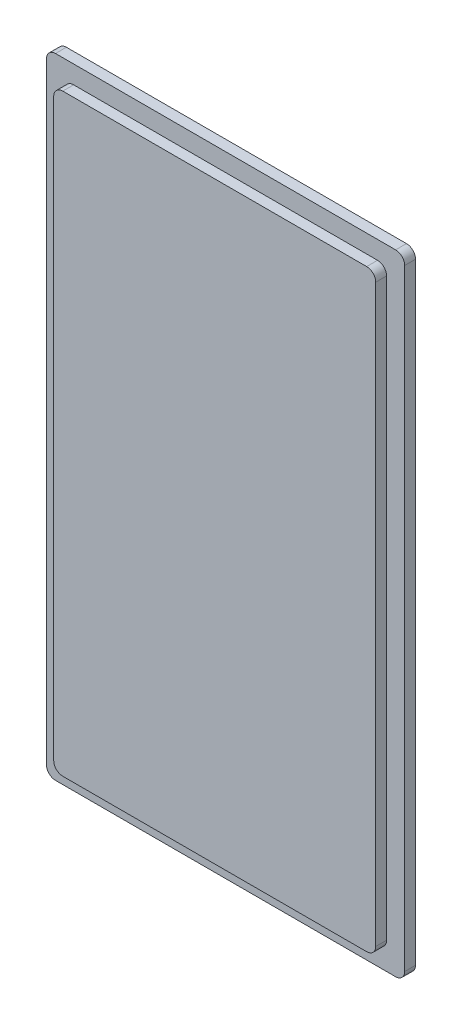
ISO-10303-21;
HEADER;
FILE_DESCRIPTION(('STEP AP214'),'2;1');
FILE_NAME('part.step','',(''),(''),'','','');
FILE_SCHEMA(('AUTOMOTIVE_DESIGN { 1 0 10303 214 1 1 1 1 }'));
ENDSEC;
DATA;
#1=APPLICATION_CONTEXT('core data for automotive mechanical design processes');
#2=APPLICATION_PROTOCOL_DEFINITION('international standard','automotive_design',2000,#1);
#3=PRODUCT_CONTEXT('',#1,'mechanical');
#4=PRODUCT('Part','Part','',(#3));
#5=PRODUCT_RELATED_PRODUCT_CATEGORY('part','',(#4));
#6=PRODUCT_DEFINITION_FORMATION('','',#4);
#7=PRODUCT_DEFINITION_CONTEXT('part definition',#1,'design');
#8=PRODUCT_DEFINITION('design','',#6,#7);
#9=PRODUCT_DEFINITION_SHAPE('','',#8);
#10=(LENGTH_UNIT() NAMED_UNIT(*) SI_UNIT(.MILLI.,.METRE.));
#11=(NAMED_UNIT(*) PLANE_ANGLE_UNIT() SI_UNIT($,.RADIAN.));
#12=(NAMED_UNIT(*) SI_UNIT($,.STERADIAN.) SOLID_ANGLE_UNIT());
#13=UNCERTAINTY_MEASURE_WITH_UNIT(LENGTH_MEASURE(1.E-05),#10,'distance_accuracy_value','');
#14=(GEOMETRIC_REPRESENTATION_CONTEXT(3) GLOBAL_UNCERTAINTY_ASSIGNED_CONTEXT((#13)) GLOBAL_UNIT_ASSIGNED_CONTEXT((#10,
#11,#12)) REPRESENTATION_CONTEXT('',''));
#15=CARTESIAN_POINT('',(0.,0.,0.));
#16=DIRECTION('',(0.,0.,1.));
#17=DIRECTION('',(1.,0.,0.));
#18=AXIS2_PLACEMENT_3D('',#15,#16,#17);
#19=CARTESIAN_POINT('',(-55.3144774068386,-300.986069156775,6.));
#20=DIRECTION('',(0.,0.,-1.));
#21=DIRECTION('',(-1.,0.,0.));
#22=AXIS2_PLACEMENT_3D('',#19,#20,#21);
#23=CYLINDRICAL_SURFACE('',#22,5.);
#24=CARTESIAN_POINT('',(-55.3144774068386,-300.986069156775,0.));
#25=DIRECTION('',(0.,0.,1.));
#26=DIRECTION('',(1.,0.,0.));
#27=AXIS2_PLACEMENT_3D('',#24,#25,#26);
#28=CIRCLE('',#27,5.);
#29=CARTESIAN_POINT('',(-60.3144774068386,-300.986069156775,0.));
#30=VERTEX_POINT('',#29);
#31=CARTESIAN_POINT('',(-55.3144774068386,-305.986069156775,0.));
#32=VERTEX_POINT('',#31);
#33=EDGE_CURVE('E149',#30,#32,#28,.T.);
#34=ORIENTED_EDGE('',*,*,#33,.T.);
#35=DIRECTION('',(0.,0.,-1.));
#36=VECTOR('',#35,1.);
#37=CARTESIAN_POINT('',(-55.3144774068386,-305.986069156775,6.));
#38=LINE('',#37,#36);
#39=CARTESIAN_POINT('',(-55.3144774068386,-305.986069156775,6.));
#40=VERTEX_POINT('',#39);
#41=EDGE_CURVE('E11',#40,#32,#38,.T.);
#42=ORIENTED_EDGE('',*,*,#41,.F.);
#43=CARTESIAN_POINT('',(-55.3144774068386,-300.986069156775,6.));
#44=DIRECTION('',(0.,0.,1.));
#45=DIRECTION('',(1.,0.,0.));
#46=AXIS2_PLACEMENT_3D('',#43,#44,#45);
#47=CIRCLE('',#46,5.);
#48=CARTESIAN_POINT('',(-60.3144774068386,-300.986069156775,6.));
#49=VERTEX_POINT('',#48);
#50=EDGE_CURVE('E158',#49,#40,#47,.T.);
#51=ORIENTED_EDGE('',*,*,#50,.F.);
#52=DIRECTION('',(0.,0.,-1.));
#53=VECTOR('',#52,1.);
#54=CARTESIAN_POINT('',(-60.3144774068386,-300.986069156775,6.));
#55=LINE('',#54,#53);
#56=EDGE_CURVE('E175',#49,#30,#55,.T.);
#57=ORIENTED_EDGE('',*,*,#56,.T.);
#58=EDGE_LOOP('',(#34,#42,#51,#57));
#59=FACE_BOUND('',#58,.T.);
#60=ADVANCED_FACE('F17',(#59),#23,.T.);
#61=CARTESIAN_POINT('',(-55.3144774068386,-305.986069156775,6.));
#62=DIRECTION('',(0.,1.,0.));
#63=DIRECTION('',(0.,0.,1.));
#64=AXIS2_PLACEMENT_3D('',#61,#62,#63);
#65=PLANE('',#64);
#66=DIRECTION('',(1.,0.,0.));
#67=VECTOR('',#66,1.);
#68=CARTESIAN_POINT('',(-55.3144774068386,-305.986069156775,0.));
#69=LINE('',#68,#67);
#70=CARTESIAN_POINT('',(132.685522593161,-305.986069156775,0.));
#71=VERTEX_POINT('',#70);
#72=EDGE_CURVE('E152',#32,#71,#69,.T.);
#73=ORIENTED_EDGE('',*,*,#72,.T.);
#74=DIRECTION('',(0.,0.,-1.));
#75=VECTOR('',#74,1.);
#76=CARTESIAN_POINT('',(132.685522593161,-305.986069156775,6.));
#77=LINE('',#76,#75);
#78=CARTESIAN_POINT('',(132.685522593161,-305.986069156775,6.));
#79=VERTEX_POINT('',#78);
#80=EDGE_CURVE('E24',#79,#71,#77,.T.);
#81=ORIENTED_EDGE('',*,*,#80,.F.);
#82=DIRECTION('',(1.,0.,0.));
#83=VECTOR('',#82,1.);
#84=CARTESIAN_POINT('',(-55.3144774068386,-305.986069156775,6.));
#85=LINE('',#84,#83);
#86=EDGE_CURVE('E161',#40,#79,#85,.T.);
#87=ORIENTED_EDGE('',*,*,#86,.F.);
#88=ORIENTED_EDGE('',*,*,#41,.T.);
#89=EDGE_LOOP('',(#73,#81,#87,#88));
#90=FACE_BOUND('',#89,.T.);
#91=ADVANCED_FACE('F233',(#90),#65,.F.);
#92=CARTESIAN_POINT('',(132.685522593161,-300.986069156775,6.));
#93=DIRECTION('',(0.,0.,-1.));
#94=DIRECTION('',(-1.,0.,0.));
#95=AXIS2_PLACEMENT_3D('',#92,#93,#94);
#96=CYLINDRICAL_SURFACE('',#95,5.);
#97=CARTESIAN_POINT('',(132.685522593161,-300.986069156775,0.));
#98=DIRECTION('',(0.,0.,1.));
#99=DIRECTION('',(1.,0.,0.));
#100=AXIS2_PLACEMENT_3D('',#97,#98,#99);
#101=CIRCLE('',#100,5.);
#102=CARTESIAN_POINT('',(137.685522593161,-300.986069156775,0.));
#103=VERTEX_POINT('',#102);
#104=EDGE_CURVE('E178',#71,#103,#101,.T.);
#105=ORIENTED_EDGE('',*,*,#104,.T.);
#106=DIRECTION('',(0.,0.,-1.));
#107=VECTOR('',#106,1.);
#108=CARTESIAN_POINT('',(137.685522593161,-300.986069156775,6.));
#109=LINE('',#108,#107);
#110=CARTESIAN_POINT('',(137.685522593161,-300.986069156775,6.));
#111=VERTEX_POINT('',#110);
#112=EDGE_CURVE('E203',#111,#103,#109,.T.);
#113=ORIENTED_EDGE('',*,*,#112,.F.);
#114=CARTESIAN_POINT('',(132.685522593161,-300.986069156775,6.));
#115=DIRECTION('',(0.,0.,1.));
#116=DIRECTION('',(1.,0.,0.));
#117=AXIS2_PLACEMENT_3D('',#114,#115,#116);
#118=CIRCLE('',#117,5.);
#119=EDGE_CURVE('E164',#79,#111,#118,.T.);
#120=ORIENTED_EDGE('',*,*,#119,.F.);
#121=ORIENTED_EDGE('',*,*,#80,.T.);
#122=EDGE_LOOP('',(#105,#113,#120,#121));
#123=FACE_BOUND('',#122,.T.);
#124=ADVANCED_FACE('F210',(#123),#96,.T.);
#125=CARTESIAN_POINT('',(137.685522593161,-300.986069156775,6.));
#126=DIRECTION('',(-1.,0.,0.));
#127=DIRECTION('',(0.,0.,1.));
#128=AXIS2_PLACEMENT_3D('',#125,#126,#127);
#129=PLANE('',#128);
#130=DIRECTION('',(0.,1.,0.));
#131=VECTOR('',#130,1.);
#132=CARTESIAN_POINT('',(137.685522593161,-300.986069156775,0.));
#133=LINE('',#132,#131);
#134=CARTESIAN_POINT('',(137.685522593161,37.0139308432251,0.));
#135=VERTEX_POINT('',#134);
#136=EDGE_CURVE('E180',#103,#135,#133,.T.);
#137=ORIENTED_EDGE('',*,*,#136,.T.);
#138=DIRECTION('',(0.,0.,-1.));
#139=VECTOR('',#138,1.);
#140=CARTESIAN_POINT('',(137.685522593161,37.0139308432251,6.));
#141=LINE('',#140,#139);
#142=CARTESIAN_POINT('',(137.685522593161,37.0139308432251,6.));
#143=VERTEX_POINT('',#142);
#144=EDGE_CURVE('E200',#143,#135,#141,.T.);
#145=ORIENTED_EDGE('',*,*,#144,.F.);
#146=DIRECTION('',(0.,1.,0.));
#147=VECTOR('',#146,1.);
#148=CARTESIAN_POINT('',(137.685522593161,-300.986069156775,6.));
#149=LINE('',#148,#147);
#150=EDGE_CURVE('E166',#111,#143,#149,.T.);
#151=ORIENTED_EDGE('',*,*,#150,.F.);
#152=ORIENTED_EDGE('',*,*,#112,.T.);
#153=EDGE_LOOP('',(#137,#145,#151,#152));
#154=FACE_BOUND('',#153,.T.);
#155=ADVANCED_FACE('F221',(#154),#129,.F.);
#156=CARTESIAN_POINT('',(132.685522593161,37.0139308432251,6.));
#157=DIRECTION('',(0.,0.,-1.));
#158=DIRECTION('',(-1.,0.,0.));
#159=AXIS2_PLACEMENT_3D('',#156,#157,#158);
#160=CYLINDRICAL_SURFACE('',#159,5.);
#161=CARTESIAN_POINT('',(132.685522593161,37.0139308432251,0.));
#162=DIRECTION('',(0.,0.,1.));
#163=DIRECTION('',(1.,0.,0.));
#164=AXIS2_PLACEMENT_3D('',#161,#162,#163);
#165=CIRCLE('',#164,5.);
#166=CARTESIAN_POINT('',(132.685522593161,42.0139308432252,0.));
#167=VERTEX_POINT('',#166);
#168=EDGE_CURVE('E182',#135,#167,#165,.T.);
#169=ORIENTED_EDGE('',*,*,#168,.T.);
#170=DIRECTION('',(0.,0.,-1.));
#171=VECTOR('',#170,1.);
#172=CARTESIAN_POINT('',(132.685522593161,42.0139308432252,6.));
#173=LINE('',#172,#171);
#174=CARTESIAN_POINT('',(132.685522593161,42.0139308432252,6.));
#175=VERTEX_POINT('',#174);
#176=EDGE_CURVE('E197',#175,#167,#173,.T.);
#177=ORIENTED_EDGE('',*,*,#176,.F.);
#178=CARTESIAN_POINT('',(132.685522593161,37.0139308432251,6.));
#179=DIRECTION('',(0.,0.,1.));
#180=DIRECTION('',(1.,0.,0.));
#181=AXIS2_PLACEMENT_3D('',#178,#179,#180);
#182=CIRCLE('',#181,5.);
#183=EDGE_CURVE('E168',#143,#175,#182,.T.);
#184=ORIENTED_EDGE('',*,*,#183,.F.);
#185=ORIENTED_EDGE('',*,*,#144,.T.);
#186=EDGE_LOOP('',(#169,#177,#184,#185));
#187=FACE_BOUND('',#186,.T.);
#188=ADVANCED_FACE('F225',(#187),#160,.T.);
#189=CARTESIAN_POINT('',(132.685522593161,42.0139308432252,6.));
#190=DIRECTION('',(0.,-1.,0.));
#191=DIRECTION('',(0.,0.,-1.));
#192=AXIS2_PLACEMENT_3D('',#189,#190,#191);
#193=PLANE('',#192);
#194=DIRECTION('',(-1.,0.,0.));
#195=VECTOR('',#194,1.);
#196=CARTESIAN_POINT('',(132.685522593161,42.0139308432252,0.));
#197=LINE('',#196,#195);
#198=CARTESIAN_POINT('',(-55.3144774068386,42.0139308432252,0.));
#199=VERTEX_POINT('',#198);
#200=EDGE_CURVE('E184',#167,#199,#197,.T.);
#201=ORIENTED_EDGE('',*,*,#200,.T.);
#202=DIRECTION('',(0.,0.,-1.));
#203=VECTOR('',#202,1.);
#204=CARTESIAN_POINT('',(-55.3144774068386,42.0139308432252,6.));
#205=LINE('',#204,#203);
#206=CARTESIAN_POINT('',(-55.3144774068386,42.0139308432252,6.));
#207=VERTEX_POINT('',#206);
#208=EDGE_CURVE('E194',#207,#199,#205,.T.);
#209=ORIENTED_EDGE('',*,*,#208,.F.);
#210=DIRECTION('',(-1.,0.,0.));
#211=VECTOR('',#210,1.);
#212=CARTESIAN_POINT('',(132.685522593161,42.0139308432252,6.));
#213=LINE('',#212,#211);
#214=EDGE_CURVE('E170',#175,#207,#213,.T.);
#215=ORIENTED_EDGE('',*,*,#214,.F.);
#216=ORIENTED_EDGE('',*,*,#176,.T.);
#217=EDGE_LOOP('',(#201,#209,#215,#216));
#218=FACE_BOUND('',#217,.T.);
#219=ADVANCED_FACE('F246',(#218),#193,.F.);
#220=CARTESIAN_POINT('',(-55.3144774068386,37.0139308432251,6.));
#221=DIRECTION('',(0.,0.,-1.));
#222=DIRECTION('',(-1.,0.,0.));
#223=AXIS2_PLACEMENT_3D('',#220,#221,#222);
#224=CYLINDRICAL_SURFACE('',#223,5.);
#225=CARTESIAN_POINT('',(-55.3144774068386,37.0139308432251,0.));
#226=DIRECTION('',(0.,0.,1.));
#227=DIRECTION('',(-1.,0.,0.));
#228=AXIS2_PLACEMENT_3D('',#225,#226,#227);
#229=CIRCLE('',#228,5.);
#230=CARTESIAN_POINT('',(-60.3144774068386,37.0139308432251,0.));
#231=VERTEX_POINT('',#230);
#232=EDGE_CURVE('E186',#199,#231,#229,.T.);
#233=ORIENTED_EDGE('',*,*,#232,.T.);
#234=DIRECTION('',(0.,0.,-1.));
#235=VECTOR('',#234,1.);
#236=CARTESIAN_POINT('',(-60.3144774068386,37.0139308432251,6.));
#237=LINE('',#236,#235);
#238=CARTESIAN_POINT('',(-60.3144774068386,37.0139308432251,6.));
#239=VERTEX_POINT('',#238);
#240=EDGE_CURVE('E191',#239,#231,#237,.T.);
#241=ORIENTED_EDGE('',*,*,#240,.F.);
#242=CARTESIAN_POINT('',(-55.3144774068386,37.0139308432251,6.));
#243=DIRECTION('',(0.,0.,1.));
#244=DIRECTION('',(-1.,0.,0.));
#245=AXIS2_PLACEMENT_3D('',#242,#243,#244);
#246=CIRCLE('',#245,5.);
#247=EDGE_CURVE('E172',#207,#239,#246,.T.);
#248=ORIENTED_EDGE('',*,*,#247,.F.);
#249=ORIENTED_EDGE('',*,*,#208,.T.);
#250=EDGE_LOOP('',(#233,#241,#248,#249));
#251=FACE_BOUND('',#250,.T.);
#252=ADVANCED_FACE('F244',(#251),#224,.T.);
#253=CARTESIAN_POINT('',(-60.3144774068386,37.0139308432251,6.));
#254=DIRECTION('',(1.,0.,0.));
#255=DIRECTION('',(0.,0.,-1.));
#256=AXIS2_PLACEMENT_3D('',#253,#254,#255);
#257=PLANE('',#256);
#258=DIRECTION('',(0.,-1.,0.));
#259=VECTOR('',#258,1.);
#260=CARTESIAN_POINT('',(-60.3144774068386,37.0139308432251,0.));
#261=LINE('',#260,#259);
#262=EDGE_CURVE('E162',#231,#30,#261,.T.);
#263=ORIENTED_EDGE('',*,*,#262,.T.);
#264=ORIENTED_EDGE('',*,*,#56,.F.);
#265=DIRECTION('',(0.,-1.,0.));
#266=VECTOR('',#265,1.);
#267=CARTESIAN_POINT('',(-60.3144774068386,37.0139308432251,6.));
#268=LINE('',#267,#266);
#269=EDGE_CURVE('E174',#239,#49,#268,.T.);
#270=ORIENTED_EDGE('',*,*,#269,.F.);
#271=ORIENTED_EDGE('',*,*,#240,.T.);
#272=EDGE_LOOP('',(#263,#264,#270,#271));
#273=FACE_BOUND('',#272,.T.);
#274=ADVANCED_FACE('F239',(#273),#257,.F.);
#275=CARTESIAN_POINT('',(-55.3144774068386,-300.986069156775,6.));
#276=DIRECTION('',(0.,0.,1.));
#277=DIRECTION('',(1.,0.,0.));
#278=AXIS2_PLACEMENT_3D('',#275,#276,#277);
#279=PLANE('',#278);
#280=CARTESIAN_POINT('',(-45.3144774068386,27.0139308432251,6.));
#281=DIRECTION('',(0.,0.,1.));
#282=DIRECTION('',(-1.,0.,0.));
#283=AXIS2_PLACEMENT_3D('',#280,#281,#282);
#284=CIRCLE('',#283,5.);
#285=CARTESIAN_POINT('',(-45.3144774068386,32.0139308432252,6.));
#286=VERTEX_POINT('',#285);
#287=CARTESIAN_POINT('',(-50.3144774068386,27.0139308432251,6.));
#288=VERTEX_POINT('',#287);
#289=EDGE_CURVE('E31',#286,#288,#284,.T.);
#290=ORIENTED_EDGE('',*,*,#289,.F.);
#291=DIRECTION('',(-1.,0.,0.));
#292=VECTOR('',#291,1.);
#293=CARTESIAN_POINT('',(-45.3144774068386,32.0139308432252,6.));
#294=LINE('',#293,#292);
#295=CARTESIAN_POINT('',(122.685522593161,32.0139308432252,6.));
#296=VERTEX_POINT('',#295);
#297=EDGE_CURVE('E35',#296,#286,#294,.T.);
#298=ORIENTED_EDGE('',*,*,#297,.F.);
#299=CARTESIAN_POINT('',(122.685522593161,27.0139308432252,6.));
#300=DIRECTION('',(0.,0.,1.));
#301=DIRECTION('',(-1.,0.,0.));
#302=AXIS2_PLACEMENT_3D('',#299,#300,#301);
#303=CIRCLE('',#302,5.);
#304=CARTESIAN_POINT('',(127.685522593161,27.0139308432251,6.));
#305=VERTEX_POINT('',#304);
#306=EDGE_CURVE('E412',#305,#296,#303,.T.);
#307=ORIENTED_EDGE('',*,*,#306,.F.);
#308=DIRECTION('',(0.,1.,0.));
#309=VECTOR('',#308,1.);
#310=CARTESIAN_POINT('',(127.685522593161,27.0139308432251,6.));
#311=LINE('',#310,#309);
#312=CARTESIAN_POINT('',(127.685522593161,-290.986069156775,6.));
#313=VERTEX_POINT('',#312);
#314=EDGE_CURVE('E446',#313,#305,#311,.T.);
#315=ORIENTED_EDGE('',*,*,#314,.F.);
#316=CARTESIAN_POINT('',(122.685522593161,-290.986069156775,6.));
#317=DIRECTION('',(0.,0.,1.));
#318=DIRECTION('',(-1.,0.,0.));
#319=AXIS2_PLACEMENT_3D('',#316,#317,#318);
#320=CIRCLE('',#319,5.);
#321=CARTESIAN_POINT('',(122.685522593161,-295.986069156775,6.));
#322=VERTEX_POINT('',#321);
#323=EDGE_CURVE('E439',#322,#313,#320,.T.);
#324=ORIENTED_EDGE('',*,*,#323,.F.);
#325=DIRECTION('',(1.,0.,0.));
#326=VECTOR('',#325,1.);
#327=CARTESIAN_POINT('',(-45.3144774068385,-295.986069156775,6.));
#328=LINE('',#327,#326);
#329=CARTESIAN_POINT('',(-45.3144774068385,-295.986069156775,6.));
#330=VERTEX_POINT('',#329);
#331=EDGE_CURVE('E433',#330,#322,#328,.T.);
#332=ORIENTED_EDGE('',*,*,#331,.F.);
#333=CARTESIAN_POINT('',(-45.3144774068386,-290.986069156775,6.));
#334=DIRECTION('',(0.,0.,1.));
#335=DIRECTION('',(-1.,0.,0.));
#336=AXIS2_PLACEMENT_3D('',#333,#334,#335);
#337=CIRCLE('',#336,5.);
#338=CARTESIAN_POINT('',(-50.3144774068386,-290.986069156775,6.));
#339=VERTEX_POINT('',#338);
#340=EDGE_CURVE('E436',#339,#330,#337,.T.);
#341=ORIENTED_EDGE('',*,*,#340,.F.);
#342=DIRECTION('',(0.,-1.,0.));
#343=VECTOR('',#342,1.);
#344=CARTESIAN_POINT('',(-50.3144774068386,27.0139308432251,6.));
#345=LINE('',#344,#343);
#346=EDGE_CURVE('E437',#288,#339,#345,.T.);
#347=ORIENTED_EDGE('',*,*,#346,.F.);
#348=EDGE_LOOP('',(#290,#298,#307,#315,#324,#332,#341,#347));
#349=FACE_BOUND('',#348,.T.);
#350=ORIENTED_EDGE('',*,*,#50,.T.);
#351=ORIENTED_EDGE('',*,*,#86,.T.);
#352=ORIENTED_EDGE('',*,*,#119,.T.);
#353=ORIENTED_EDGE('',*,*,#150,.T.);
#354=ORIENTED_EDGE('',*,*,#183,.T.);
#355=ORIENTED_EDGE('',*,*,#214,.T.);
#356=ORIENTED_EDGE('',*,*,#247,.T.);
#357=ORIENTED_EDGE('',*,*,#269,.T.);
#358=EDGE_LOOP('',(#350,#351,#352,#353,#354,#355,#356,#357));
#359=FACE_BOUND('',#358,.T.);
#360=ADVANCED_FACE('F229',(#349,#359),#279,.T.);
#361=CARTESIAN_POINT('',(-55.3144774068386,-300.986069156775,0.));
#362=DIRECTION('',(0.,0.,1.));
#363=DIRECTION('',(1.,0.,0.));
#364=AXIS2_PLACEMENT_3D('',#361,#362,#363);
#365=PLANE('',#364);
#366=ORIENTED_EDGE('',*,*,#33,.F.);
#367=ORIENTED_EDGE('',*,*,#262,.F.);
#368=ORIENTED_EDGE('',*,*,#232,.F.);
#369=ORIENTED_EDGE('',*,*,#200,.F.);
#370=ORIENTED_EDGE('',*,*,#168,.F.);
#371=ORIENTED_EDGE('',*,*,#136,.F.);
#372=ORIENTED_EDGE('',*,*,#104,.F.);
#373=ORIENTED_EDGE('',*,*,#72,.F.);
#374=EDGE_LOOP('',(#366,#367,#368,#369,#370,#371,#372,#373));
#375=FACE_BOUND('',#374,.T.);
#376=ADVANCED_FACE('F216',(#375),#365,.F.);
#377=CARTESIAN_POINT('',(-45.3144774068386,27.0139308432251,12.));
#378=DIRECTION('',(0.,0.,-1.));
#379=DIRECTION('',(-1.,0.,0.));
#380=AXIS2_PLACEMENT_3D('',#377,#378,#379);
#381=CYLINDRICAL_SURFACE('',#380,5.);
#382=ORIENTED_EDGE('',*,*,#289,.T.);
#383=DIRECTION('',(0.,0.,-1.));
#384=VECTOR('',#383,1.);
#385=CARTESIAN_POINT('',(-50.3144774068386,27.0139308432251,12.));
#386=LINE('',#385,#384);
#387=CARTESIAN_POINT('',(-50.3144774068386,27.0139308432251,12.));
#388=VERTEX_POINT('',#387);
#389=EDGE_CURVE('E132',#388,#288,#386,.T.);
#390=ORIENTED_EDGE('',*,*,#389,.F.);
#391=CARTESIAN_POINT('',(-45.3144774068386,27.0139308432251,12.));
#392=DIRECTION('',(0.,0.,1.));
#393=DIRECTION('',(-1.,0.,0.));
#394=AXIS2_PLACEMENT_3D('',#391,#392,#393);
#395=CIRCLE('',#394,5.);
#396=CARTESIAN_POINT('',(-45.3144774068386,32.0139308432252,12.));
#397=VERTEX_POINT('',#396);
#398=EDGE_CURVE('E138',#397,#388,#395,.T.);
#399=ORIENTED_EDGE('',*,*,#398,.F.);
#400=DIRECTION('',(0.,0.,-1.));
#401=VECTOR('',#400,1.);
#402=CARTESIAN_POINT('',(-45.3144774068386,32.0139308432252,12.));
#403=LINE('',#402,#401);
#404=EDGE_CURVE('E409',#397,#286,#403,.T.);
#405=ORIENTED_EDGE('',*,*,#404,.T.);
#406=EDGE_LOOP('',(#382,#390,#399,#405));
#407=FACE_BOUND('',#406,.T.);
#408=ADVANCED_FACE('F148',(#407),#381,.T.);
#409=CARTESIAN_POINT('',(-50.3144774068386,27.0139308432251,12.));
#410=DIRECTION('',(1.,0.,0.));
#411=DIRECTION('',(0.,1.,0.));
#412=AXIS2_PLACEMENT_3D('',#409,#410,#411);
#413=PLANE('',#412);
#414=ORIENTED_EDGE('',*,*,#346,.T.);
#415=DIRECTION('',(0.,0.,-1.));
#416=VECTOR('',#415,1.);
#417=CARTESIAN_POINT('',(-50.3144774068386,-290.986069156775,12.));
#418=LINE('',#417,#416);
#419=CARTESIAN_POINT('',(-50.3144774068386,-290.986069156775,12.));
#420=VERTEX_POINT('',#419);
#421=EDGE_CURVE('E134',#420,#339,#418,.T.);
#422=ORIENTED_EDGE('',*,*,#421,.F.);
#423=DIRECTION('',(0.,-1.,0.));
#424=VECTOR('',#423,1.);
#425=CARTESIAN_POINT('',(-50.3144774068386,27.0139308432251,12.));
#426=LINE('',#425,#424);
#427=EDGE_CURVE('E127',#388,#420,#426,.T.);
#428=ORIENTED_EDGE('',*,*,#427,.F.);
#429=ORIENTED_EDGE('',*,*,#389,.T.);
#430=EDGE_LOOP('',(#414,#422,#428,#429));
#431=FACE_BOUND('',#430,.T.);
#432=ADVANCED_FACE('F130',(#431),#413,.F.);
#433=CARTESIAN_POINT('',(-45.3144774068386,-290.986069156775,12.));
#434=DIRECTION('',(0.,0.,-1.));
#435=DIRECTION('',(-1.,0.,0.));
#436=AXIS2_PLACEMENT_3D('',#433,#434,#435);
#437=CYLINDRICAL_SURFACE('',#436,5.);
#438=ORIENTED_EDGE('',*,*,#340,.T.);
#439=DIRECTION('',(0.,0.,-1.));
#440=VECTOR('',#439,1.);
#441=CARTESIAN_POINT('',(-45.3144774068385,-295.986069156775,12.));
#442=LINE('',#441,#440);
#443=CARTESIAN_POINT('',(-45.3144774068385,-295.986069156775,12.));
#444=VERTEX_POINT('',#443);
#445=EDGE_CURVE('E154',#444,#330,#442,.T.);
#446=ORIENTED_EDGE('',*,*,#445,.F.);
#447=CARTESIAN_POINT('',(-45.3144774068386,-290.986069156775,12.));
#448=DIRECTION('',(0.,0.,1.));
#449=DIRECTION('',(-1.,0.,0.));
#450=AXIS2_PLACEMENT_3D('',#447,#448,#449);
#451=CIRCLE('',#450,5.);
#452=EDGE_CURVE('E137',#420,#444,#451,.T.);
#453=ORIENTED_EDGE('',*,*,#452,.F.);
#454=ORIENTED_EDGE('',*,*,#421,.T.);
#455=EDGE_LOOP('',(#438,#446,#453,#454));
#456=FACE_BOUND('',#455,.T.);
#457=ADVANCED_FACE('F335',(#456),#437,.T.);
#458=CARTESIAN_POINT('',(-45.3144774068385,-295.986069156775,12.));
#459=DIRECTION('',(0.,1.,0.));
#460=DIRECTION('',(0.,0.,1.));
#461=AXIS2_PLACEMENT_3D('',#458,#459,#460);
#462=PLANE('',#461);
#463=ORIENTED_EDGE('',*,*,#331,.T.);
#464=DIRECTION('',(0.,0.,-1.));
#465=VECTOR('',#464,1.);
#466=CARTESIAN_POINT('',(122.685522593161,-295.986069156775,12.));
#467=LINE('',#466,#465);
#468=CARTESIAN_POINT('',(122.685522593161,-295.986069156775,12.));
#469=VERTEX_POINT('',#468);
#470=EDGE_CURVE('E426',#469,#322,#467,.T.);
#471=ORIENTED_EDGE('',*,*,#470,.F.);
#472=DIRECTION('',(1.,0.,0.));
#473=VECTOR('',#472,1.);
#474=CARTESIAN_POINT('',(-45.3144774068385,-295.986069156775,12.));
#475=LINE('',#474,#473);
#476=EDGE_CURVE('E434',#444,#469,#475,.T.);
#477=ORIENTED_EDGE('',*,*,#476,.F.);
#478=ORIENTED_EDGE('',*,*,#445,.T.);
#479=EDGE_LOOP('',(#463,#471,#477,#478));
#480=FACE_BOUND('',#479,.T.);
#481=ADVANCED_FACE('F344',(#480),#462,.F.);
#482=CARTESIAN_POINT('',(122.685522593161,-290.986069156775,12.));
#483=DIRECTION('',(0.,0.,-1.));
#484=DIRECTION('',(-1.,0.,0.));
#485=AXIS2_PLACEMENT_3D('',#482,#483,#484);
#486=CYLINDRICAL_SURFACE('',#485,5.);
#487=ORIENTED_EDGE('',*,*,#323,.T.);
#488=DIRECTION('',(0.,0.,-1.));
#489=VECTOR('',#488,1.);
#490=CARTESIAN_POINT('',(127.685522593161,-290.986069156775,12.));
#491=LINE('',#490,#489);
#492=CARTESIAN_POINT('',(127.685522593161,-290.986069156775,12.));
#493=VERTEX_POINT('',#492);
#494=EDGE_CURVE('E423',#493,#313,#491,.T.);
#495=ORIENTED_EDGE('',*,*,#494,.F.);
#496=CARTESIAN_POINT('',(122.685522593161,-290.986069156775,12.));
#497=DIRECTION('',(0.,0.,1.));
#498=DIRECTION('',(-1.,0.,0.));
#499=AXIS2_PLACEMENT_3D('',#496,#497,#498);
#500=CIRCLE('',#499,5.);
#501=EDGE_CURVE('E454',#469,#493,#500,.T.);
#502=ORIENTED_EDGE('',*,*,#501,.F.);
#503=ORIENTED_EDGE('',*,*,#470,.T.);
#504=EDGE_LOOP('',(#487,#495,#502,#503));
#505=FACE_BOUND('',#504,.T.);
#506=ADVANCED_FACE('F354',(#505),#486,.T.);
#507=CARTESIAN_POINT('',(127.685522593161,27.0139308432251,12.));
#508=DIRECTION('',(-1.,0.,0.));
#509=DIRECTION('',(0.,-1.,0.));
#510=AXIS2_PLACEMENT_3D('',#507,#508,#509);
#511=PLANE('',#510);
#512=ORIENTED_EDGE('',*,*,#314,.T.);
#513=DIRECTION('',(0.,0.,-1.));
#514=VECTOR('',#513,1.);
#515=CARTESIAN_POINT('',(127.685522593161,27.0139308432251,12.));
#516=LINE('',#515,#514);
#517=CARTESIAN_POINT('',(127.685522593161,27.0139308432251,12.));
#518=VERTEX_POINT('',#517);
#519=EDGE_CURVE('E415',#518,#305,#516,.T.);
#520=ORIENTED_EDGE('',*,*,#519,.F.);
#521=DIRECTION('',(0.,1.,0.));
#522=VECTOR('',#521,1.);
#523=CARTESIAN_POINT('',(127.685522593161,27.0139308432251,12.));
#524=LINE('',#523,#522);
#525=EDGE_CURVE('E452',#493,#518,#524,.T.);
#526=ORIENTED_EDGE('',*,*,#525,.F.);
#527=ORIENTED_EDGE('',*,*,#494,.T.);
#528=EDGE_LOOP('',(#512,#520,#526,#527));
#529=FACE_BOUND('',#528,.T.);
#530=ADVANCED_FACE('F364',(#529),#511,.F.);
#531=CARTESIAN_POINT('',(122.685522593161,27.0139308432252,12.));
#532=DIRECTION('',(0.,0.,-1.));
#533=DIRECTION('',(-1.,0.,0.));
#534=AXIS2_PLACEMENT_3D('',#531,#532,#533);
#535=CYLINDRICAL_SURFACE('',#534,5.);
#536=ORIENTED_EDGE('',*,*,#306,.T.);
#537=DIRECTION('',(0.,0.,-1.));
#538=VECTOR('',#537,1.);
#539=CARTESIAN_POINT('',(122.685522593161,32.0139308432252,12.));
#540=LINE('',#539,#538);
#541=CARTESIAN_POINT('',(122.685522593161,32.0139308432252,12.));
#542=VERTEX_POINT('',#541);
#543=EDGE_CURVE('E411',#542,#296,#540,.T.);
#544=ORIENTED_EDGE('',*,*,#543,.F.);
#545=CARTESIAN_POINT('',(122.685522593161,27.0139308432252,12.));
#546=DIRECTION('',(0.,0.,1.));
#547=DIRECTION('',(-1.,0.,0.));
#548=AXIS2_PLACEMENT_3D('',#545,#546,#547);
#549=CIRCLE('',#548,5.);
#550=EDGE_CURVE('E417',#518,#542,#549,.T.);
#551=ORIENTED_EDGE('',*,*,#550,.F.);
#552=ORIENTED_EDGE('',*,*,#519,.T.);
#553=EDGE_LOOP('',(#536,#544,#551,#552));
#554=FACE_BOUND('',#553,.T.);
#555=ADVANCED_FACE('F374',(#554),#535,.T.);
#556=CARTESIAN_POINT('',(-45.3144774068386,32.0139308432252,12.));
#557=DIRECTION('',(0.,-1.,0.));
#558=DIRECTION('',(1.,0.,0.));
#559=AXIS2_PLACEMENT_3D('',#556,#557,#558);
#560=PLANE('',#559);
#561=ORIENTED_EDGE('',*,*,#297,.T.);
#562=ORIENTED_EDGE('',*,*,#404,.F.);
#563=DIRECTION('',(-1.,0.,0.));
#564=VECTOR('',#563,1.);
#565=CARTESIAN_POINT('',(-45.3144774068386,32.0139308432252,12.));
#566=LINE('',#565,#564);
#567=EDGE_CURVE('E143',#542,#397,#566,.T.);
#568=ORIENTED_EDGE('',*,*,#567,.F.);
#569=ORIENTED_EDGE('',*,*,#543,.T.);
#570=EDGE_LOOP('',(#561,#562,#568,#569));
#571=FACE_BOUND('',#570,.T.);
#572=ADVANCED_FACE('F384',(#571),#560,.F.);
#573=CARTESIAN_POINT('',(-45.3144774068386,27.0139308432251,12.));
#574=DIRECTION('',(0.,0.,-1.));
#575=DIRECTION('',(-1.,0.,0.));
#576=AXIS2_PLACEMENT_3D('',#573,#574,#575);
#577=PLANE('',#576);
#578=ORIENTED_EDGE('',*,*,#398,.T.);
#579=ORIENTED_EDGE('',*,*,#427,.T.);
#580=ORIENTED_EDGE('',*,*,#452,.T.);
#581=ORIENTED_EDGE('',*,*,#476,.T.);
#582=ORIENTED_EDGE('',*,*,#501,.T.);
#583=ORIENTED_EDGE('',*,*,#525,.T.);
#584=ORIENTED_EDGE('',*,*,#550,.T.);
#585=ORIENTED_EDGE('',*,*,#567,.T.);
#586=EDGE_LOOP('',(#578,#579,#580,#581,#582,#583,#584,#585));
#587=FACE_BOUND('',#586,.T.);
#588=ADVANCED_FACE('F141',(#587),#577,.F.);
#589=CLOSED_SHELL('',(#60,#91,#124,#155,#188,#219,#252,#274,#360,#376,#408,#432,#457,#481,#506,
#530,#555,#572,#588));
#590=MANIFOLD_SOLID_BREP('B1',#589);
#591=ADVANCED_BREP_SHAPE_REPRESENTATION('',(#18,#590),#14);
#592=SHAPE_DEFINITION_REPRESENTATION(#9,#591);
ENDSEC;
END-ISO-10303-21;
